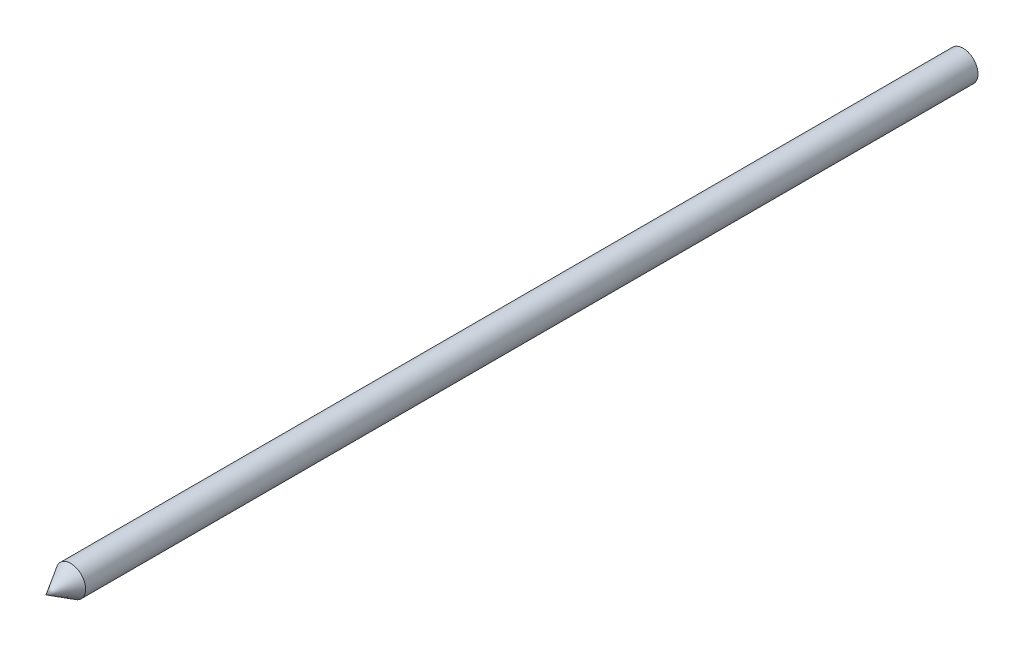
ISO-10303-21;
HEADER;
FILE_DESCRIPTION(('STEP AP214'),'2;1');
FILE_NAME('part.step','',(''),(''),'','','');
FILE_SCHEMA(('AUTOMOTIVE_DESIGN { 1 0 10303 214 1 1 1 1 }'));
ENDSEC;
DATA;
#1=APPLICATION_CONTEXT('core data for automotive mechanical design processes');
#2=APPLICATION_PROTOCOL_DEFINITION('international standard','automotive_design',2000,#1);
#3=PRODUCT_CONTEXT('',#1,'mechanical');
#4=PRODUCT('Part','Part','',(#3));
#5=PRODUCT_RELATED_PRODUCT_CATEGORY('part','',(#4));
#6=PRODUCT_DEFINITION_FORMATION('','',#4);
#7=PRODUCT_DEFINITION_CONTEXT('part definition',#1,'design');
#8=PRODUCT_DEFINITION('design','',#6,#7);
#9=PRODUCT_DEFINITION_SHAPE('','',#8);
#10=(LENGTH_UNIT() NAMED_UNIT(*) SI_UNIT(.MILLI.,.METRE.));
#11=(NAMED_UNIT(*) PLANE_ANGLE_UNIT() SI_UNIT($,.RADIAN.));
#12=(NAMED_UNIT(*) SI_UNIT($,.STERADIAN.) SOLID_ANGLE_UNIT());
#13=UNCERTAINTY_MEASURE_WITH_UNIT(LENGTH_MEASURE(1.E-05),#10,'distance_accuracy_value','');
#14=(GEOMETRIC_REPRESENTATION_CONTEXT(3) GLOBAL_UNCERTAINTY_ASSIGNED_CONTEXT((#13)) GLOBAL_UNIT_ASSIGNED_CONTEXT((#10,
#11,#12)) REPRESENTATION_CONTEXT('',''));
#15=CARTESIAN_POINT('',(0.,0.,0.));
#16=DIRECTION('',(0.,0.,1.));
#17=DIRECTION('',(1.,0.,0.));
#18=AXIS2_PLACEMENT_3D('',#15,#16,#17);
#19=CARTESIAN_POINT('',(0.,0.,900.));
#20=DIRECTION('',(0.,0.,-1.));
#21=DIRECTION('',(-1.,0.,0.));
#22=AXIS2_PLACEMENT_3D('',#19,#20,#21);
#23=CYLINDRICAL_SURFACE('',#22,15.);
#24=CARTESIAN_POINT('',(0.,0.,900.));
#25=DIRECTION('',(0.,0.,1.));
#26=DIRECTION('',(1.,0.,0.));
#27=AXIS2_PLACEMENT_3D('',#24,#25,#26);
#28=CIRCLE('',#27,15.);
#29=CARTESIAN_POINT('',(15.,0.,900.));
#30=VERTEX_POINT('',#29);
#31=EDGE_CURVE('E11',#30,#30,#28,.T.);
#32=ORIENTED_EDGE('',*,*,#31,.F.);
#33=EDGE_LOOP('',(#32));
#34=FACE_BOUND('',#33,.T.);
#35=CARTESIAN_POINT('',(0.,0.,0.));
#36=DIRECTION('',(0.,0.,1.));
#37=DIRECTION('',(1.,0.,0.));
#38=AXIS2_PLACEMENT_3D('',#35,#36,#37);
#39=CIRCLE('',#38,15.);
#40=CARTESIAN_POINT('',(15.,0.,0.));
#41=VERTEX_POINT('',#40);
#42=EDGE_CURVE('E36',#41,#41,#39,.T.);
#43=ORIENTED_EDGE('',*,*,#42,.T.);
#44=EDGE_LOOP('',(#43));
#45=FACE_BOUND('',#44,.T.);
#46=ADVANCED_FACE('F33',(#34,#45),#23,.T.);
#47=CARTESIAN_POINT('',(0.,0.,0.));
#48=DIRECTION('',(0.,0.,1.));
#49=DIRECTION('',(1.,0.,0.));
#50=AXIS2_PLACEMENT_3D('',#47,#48,#49);
#51=PLANE('',#50);
#52=ORIENTED_EDGE('',*,*,#42,.F.);
#53=EDGE_LOOP('',(#52));
#54=FACE_BOUND('',#53,.T.);
#55=ADVANCED_FACE('F45',(#54),#51,.F.);
#56=CARTESIAN_POINT('',(0.,0.,900.));
#57=DIRECTION('',(0.,0.,-1.));
#58=DIRECTION('',(1.,0.,0.));
#59=AXIS2_PLACEMENT_3D('',#56,#57,#58);
#60=CONICAL_SURFACE('',#59,15.,0.541052068118242);
#61=CARTESIAN_POINT('',(0.,0.,924.964192235258));
#62=VERTEX_POINT('',#61);
#63=VERTEX_LOOP('',#62);
#64=FACE_BOUND('',#63,.T.);
#65=ORIENTED_EDGE('',*,*,#31,.T.);
#66=EDGE_LOOP('',(#65));
#67=FACE_BOUND('',#66,.T.);
#68=ADVANCED_FACE('F42',(#64,#67),#60,.T.);
#69=CLOSED_SHELL('',(#46,#55,#68));
#70=MANIFOLD_SOLID_BREP('B2',#69);
#71=ADVANCED_BREP_SHAPE_REPRESENTATION('',(#18,#70),#14);
#72=SHAPE_DEFINITION_REPRESENTATION(#9,#71);
ENDSEC;
END-ISO-10303-21;
